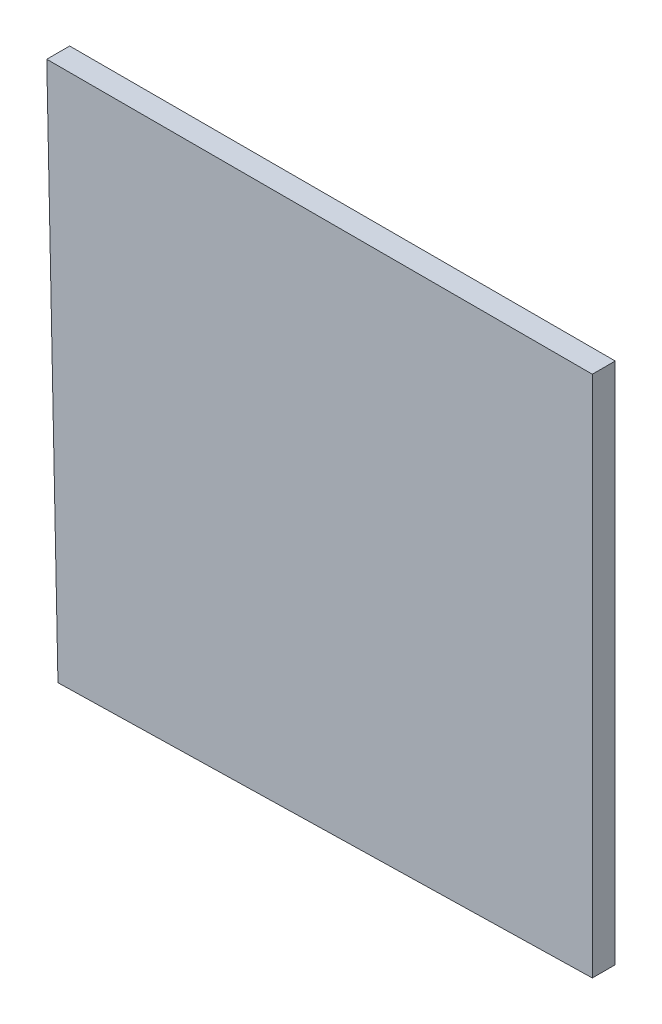
ISO-10303-21;
HEADER;
FILE_DESCRIPTION(('STEP AP214'),'2;1');
FILE_NAME('part.step','',(''),(''),'','','');
FILE_SCHEMA(('AUTOMOTIVE_DESIGN { 1 0 10303 214 1 1 1 1 }'));
ENDSEC;
DATA;
#1=APPLICATION_CONTEXT('core data for automotive mechanical design processes');
#2=APPLICATION_PROTOCOL_DEFINITION('international standard','automotive_design',2000,#1);
#3=PRODUCT_CONTEXT('',#1,'mechanical');
#4=PRODUCT('Part','Part','',(#3));
#5=PRODUCT_RELATED_PRODUCT_CATEGORY('part','',(#4));
#6=PRODUCT_DEFINITION_FORMATION('','',#4);
#7=PRODUCT_DEFINITION_CONTEXT('part definition',#1,'design');
#8=PRODUCT_DEFINITION('design','',#6,#7);
#9=PRODUCT_DEFINITION_SHAPE('','',#8);
#10=(LENGTH_UNIT() NAMED_UNIT(*) SI_UNIT(.MILLI.,.METRE.));
#11=(NAMED_UNIT(*) PLANE_ANGLE_UNIT() SI_UNIT($,.RADIAN.));
#12=(NAMED_UNIT(*) SI_UNIT($,.STERADIAN.) SOLID_ANGLE_UNIT());
#13=UNCERTAINTY_MEASURE_WITH_UNIT(LENGTH_MEASURE(1.E-05),#10,'distance_accuracy_value','');
#14=(GEOMETRIC_REPRESENTATION_CONTEXT(3) GLOBAL_UNCERTAINTY_ASSIGNED_CONTEXT((#13)) GLOBAL_UNIT_ASSIGNED_CONTEXT((#10,
#11,#12)) REPRESENTATION_CONTEXT('',''));
#15=CARTESIAN_POINT('',(0.,0.,0.));
#16=DIRECTION('',(0.,0.,1.));
#17=DIRECTION('',(1.,0.,0.));
#18=AXIS2_PLACEMENT_3D('',#15,#16,#17);
#19=CARTESIAN_POINT('',(134.682675278831,82.6154838709677,10.));
#20=DIRECTION('',(-1.,0.,0.));
#21=DIRECTION('',(0.,0.,1.));
#22=AXIS2_PLACEMENT_3D('',#19,#20,#21);
#23=PLANE('',#22);
#24=DIRECTION('',(0.,1.,0.));
#25=VECTOR('',#24,1.);
#26=CARTESIAN_POINT('',(134.682675278831,82.6154838709677,0.));
#27=LINE('',#26,#25);
#28=CARTESIAN_POINT('',(134.682675278831,-145.724516129032,0.));
#29=VERTEX_POINT('',#28);
#30=CARTESIAN_POINT('',(134.682675278831,82.6154838709677,0.));
#31=VERTEX_POINT('',#30);
#32=EDGE_CURVE('E106',#29,#31,#27,.T.);
#33=ORIENTED_EDGE('',*,*,#32,.T.);
#34=DIRECTION('',(0.,0.,-1.));
#35=VECTOR('',#34,1.);
#36=CARTESIAN_POINT('',(134.682675278831,82.6154838709677,10.));
#37=LINE('',#36,#35);
#38=CARTESIAN_POINT('',(134.682675278831,82.6154838709677,10.));
#39=VERTEX_POINT('',#38);
#40=EDGE_CURVE('E11',#39,#31,#37,.T.);
#41=ORIENTED_EDGE('',*,*,#40,.F.);
#42=DIRECTION('',(0.,1.,0.));
#43=VECTOR('',#42,1.);
#44=CARTESIAN_POINT('',(134.682675278831,82.6154838709677,10.));
#45=LINE('',#44,#43);
#46=CARTESIAN_POINT('',(134.682675278831,-145.724516129032,10.));
#47=VERTEX_POINT('',#46);
#48=EDGE_CURVE('E94',#47,#39,#45,.T.);
#49=ORIENTED_EDGE('',*,*,#48,.F.);
#50=DIRECTION('',(0.,0.,-1.));
#51=VECTOR('',#50,1.);
#52=CARTESIAN_POINT('',(134.682675278831,-145.724516129032,10.));
#53=LINE('',#52,#51);
#54=EDGE_CURVE('E102',#47,#29,#53,.T.);
#55=ORIENTED_EDGE('',*,*,#54,.T.);
#56=EDGE_LOOP('',(#33,#41,#49,#55));
#57=FACE_BOUND('',#56,.T.);
#58=ADVANCED_FACE('F43',(#57),#23,.F.);
#59=CARTESIAN_POINT('',(-103.557324721169,82.6154838709677,10.));
#60=DIRECTION('',(0.,-1.,0.));
#61=DIRECTION('',(0.,0.,-1.));
#62=AXIS2_PLACEMENT_3D('',#59,#60,#61);
#63=PLANE('',#62);
#64=DIRECTION('',(-1.,0.,0.));
#65=VECTOR('',#64,1.);
#66=CARTESIAN_POINT('',(-103.557324721169,82.6154838709677,0.));
#67=LINE('',#66,#65);
#68=CARTESIAN_POINT('',(-103.557324721169,82.6154838709677,0.));
#69=VERTEX_POINT('',#68);
#70=EDGE_CURVE('E98',#31,#69,#67,.T.);
#71=ORIENTED_EDGE('',*,*,#70,.T.);
#72=DIRECTION('',(0.,0.,-1.));
#73=VECTOR('',#72,1.);
#74=CARTESIAN_POINT('',(-103.557324721169,82.6154838709677,10.));
#75=LINE('',#74,#73);
#76=CARTESIAN_POINT('',(-103.557324721169,82.6154838709677,10.));
#77=VERTEX_POINT('',#76);
#78=EDGE_CURVE('E51',#77,#69,#75,.T.);
#79=ORIENTED_EDGE('',*,*,#78,.F.);
#80=DIRECTION('',(-1.,0.,0.));
#81=VECTOR('',#80,1.);
#82=CARTESIAN_POINT('',(-103.557324721169,82.6154838709677,10.));
#83=LINE('',#82,#81);
#84=EDGE_CURVE('E89',#39,#77,#83,.T.);
#85=ORIENTED_EDGE('',*,*,#84,.F.);
#86=ORIENTED_EDGE('',*,*,#40,.T.);
#87=EDGE_LOOP('',(#71,#79,#85,#86));
#88=FACE_BOUND('',#87,.T.);
#89=ADVANCED_FACE('F97',(#88),#63,.F.);
#90=CARTESIAN_POINT('',(-98.6673247211686,-150.734516129032,10.));
#91=DIRECTION('',(0.999780502739559,0.0209510463183906,0.));
#92=DIRECTION('',(-0.0209510463183906,0.999780502739559,0.));
#93=AXIS2_PLACEMENT_3D('',#90,#91,#92);
#94=PLANE('',#93);
#95=DIRECTION('',(0.0209510463183906,-0.999780502739559,0.));
#96=VECTOR('',#95,1.);
#97=CARTESIAN_POINT('',(-98.6673247211686,-150.734516129032,0.));
#98=LINE('',#97,#96);
#99=CARTESIAN_POINT('',(-98.6673247211686,-150.734516129032,0.));
#100=VERTEX_POINT('',#99);
#101=EDGE_CURVE('E76',#69,#100,#98,.T.);
#102=ORIENTED_EDGE('',*,*,#101,.T.);
#103=DIRECTION('',(0.,0.,-1.));
#104=VECTOR('',#103,1.);
#105=CARTESIAN_POINT('',(-98.6673247211686,-150.734516129032,10.));
#106=LINE('',#105,#104);
#107=CARTESIAN_POINT('',(-98.6673247211686,-150.734516129032,10.));
#108=VERTEX_POINT('',#107);
#109=EDGE_CURVE('E99',#108,#100,#106,.T.);
#110=ORIENTED_EDGE('',*,*,#109,.F.);
#111=DIRECTION('',(0.0209510463183906,-0.999780502739559,0.));
#112=VECTOR('',#111,1.);
#113=CARTESIAN_POINT('',(-98.6673247211686,-150.734516129032,10.));
#114=LINE('',#113,#112);
#115=EDGE_CURVE('E92',#77,#108,#114,.T.);
#116=ORIENTED_EDGE('',*,*,#115,.F.);
#117=ORIENTED_EDGE('',*,*,#78,.T.);
#118=EDGE_LOOP('',(#102,#110,#116,#117));
#119=FACE_BOUND('',#118,.T.);
#120=ADVANCED_FACE('F100',(#119),#94,.F.);
#121=CARTESIAN_POINT('',(134.682675278831,-145.724516129032,10.));
#122=DIRECTION('',(-0.0214649483749044,0.999769601453886,0.));
#123=DIRECTION('',(-0.999769601453886,-0.0214649483749044,0.));
#124=AXIS2_PLACEMENT_3D('',#121,#122,#123);
#125=PLANE('',#124);
#126=DIRECTION('',(0.999769601453886,0.0214649483749044,0.));
#127=VECTOR('',#126,1.);
#128=CARTESIAN_POINT('',(134.682675278831,-145.724516129032,0.));
#129=LINE('',#128,#127);
#130=EDGE_CURVE('E82',#100,#29,#129,.T.);
#131=ORIENTED_EDGE('',*,*,#130,.T.);
#132=ORIENTED_EDGE('',*,*,#54,.F.);
#133=DIRECTION('',(0.999769601453886,0.0214649483749044,0.));
#134=VECTOR('',#133,1.);
#135=CARTESIAN_POINT('',(134.682675278831,-145.724516129032,10.));
#136=LINE('',#135,#134);
#137=EDGE_CURVE('E59',#108,#47,#136,.T.);
#138=ORIENTED_EDGE('',*,*,#137,.F.);
#139=ORIENTED_EDGE('',*,*,#109,.T.);
#140=EDGE_LOOP('',(#131,#132,#138,#139));
#141=FACE_BOUND('',#140,.T.);
#142=ADVANCED_FACE('F113',(#141),#125,.F.);
#143=CARTESIAN_POINT('',(0.,0.,10.));
#144=DIRECTION('',(0.,0.,1.));
#145=DIRECTION('',(1.,0.,0.));
#146=AXIS2_PLACEMENT_3D('',#143,#144,#145);
#147=PLANE('',#146);
#148=ORIENTED_EDGE('',*,*,#48,.T.);
#149=ORIENTED_EDGE('',*,*,#84,.T.);
#150=ORIENTED_EDGE('',*,*,#115,.T.);
#151=ORIENTED_EDGE('',*,*,#137,.T.);
#152=EDGE_LOOP('',(#148,#149,#150,#151));
#153=FACE_BOUND('',#152,.T.);
#154=ADVANCED_FACE('F90',(#153),#147,.T.);
#155=CARTESIAN_POINT('',(0.,0.,0.));
#156=DIRECTION('',(0.,0.,1.));
#157=DIRECTION('',(1.,0.,0.));
#158=AXIS2_PLACEMENT_3D('',#155,#156,#157);
#159=PLANE('',#158);
#160=ORIENTED_EDGE('',*,*,#32,.F.);
#161=ORIENTED_EDGE('',*,*,#130,.F.);
#162=ORIENTED_EDGE('',*,*,#101,.F.);
#163=ORIENTED_EDGE('',*,*,#70,.F.);
#164=EDGE_LOOP('',(#160,#161,#162,#163));
#165=FACE_BOUND('',#164,.T.);
#166=ADVANCED_FACE('F116',(#165),#159,.F.);
#167=CLOSED_SHELL('',(#58,#89,#120,#142,#154,#166));
#168=MANIFOLD_SOLID_BREP('B2',#167);
#169=ADVANCED_BREP_SHAPE_REPRESENTATION('',(#18,#168),#14);
#170=SHAPE_DEFINITION_REPRESENTATION(#9,#169);
ENDSEC;
END-ISO-10303-21;
